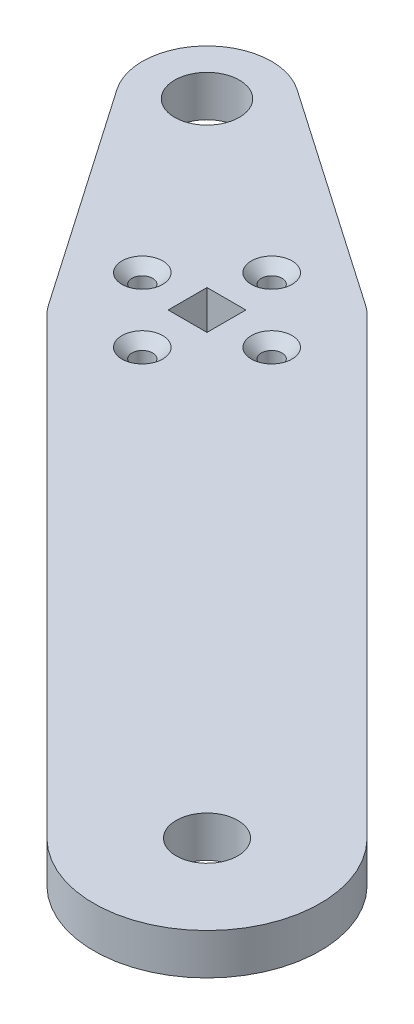
ISO-10303-21;
HEADER;
FILE_DESCRIPTION(('STEP AP214'),'2;1');
FILE_NAME('part.step','',(''),(''),'','','');
FILE_SCHEMA(('AUTOMOTIVE_DESIGN { 1 0 10303 214 1 1 1 1 }'));
ENDSEC;
DATA;
#1=APPLICATION_CONTEXT('core data for automotive mechanical design processes');
#2=APPLICATION_PROTOCOL_DEFINITION('international standard','automotive_design',2000,#1);
#3=PRODUCT_CONTEXT('',#1,'mechanical');
#4=PRODUCT('Part','Part','',(#3));
#5=PRODUCT_RELATED_PRODUCT_CATEGORY('part','',(#4));
#6=PRODUCT_DEFINITION_FORMATION('','',#4);
#7=PRODUCT_DEFINITION_CONTEXT('part definition',#1,'design');
#8=PRODUCT_DEFINITION('design','',#6,#7);
#9=PRODUCT_DEFINITION_SHAPE('','',#8);
#10=(LENGTH_UNIT() NAMED_UNIT(*) SI_UNIT(.MILLI.,.METRE.));
#11=(NAMED_UNIT(*) PLANE_ANGLE_UNIT() SI_UNIT($,.RADIAN.));
#12=(NAMED_UNIT(*) SI_UNIT($,.STERADIAN.) SOLID_ANGLE_UNIT());
#13=UNCERTAINTY_MEASURE_WITH_UNIT(LENGTH_MEASURE(1.E-05),#10,'distance_accuracy_value','');
#14=(GEOMETRIC_REPRESENTATION_CONTEXT(3) GLOBAL_UNCERTAINTY_ASSIGNED_CONTEXT((#13)) GLOBAL_UNIT_ASSIGNED_CONTEXT((#10,
#11,#12)) REPRESENTATION_CONTEXT('',''));
#15=CARTESIAN_POINT('',(0.,0.,0.));
#16=DIRECTION('',(0.,0.,1.));
#17=DIRECTION('',(1.,0.,0.));
#18=AXIS2_PLACEMENT_3D('',#15,#16,#17);
#19=CARTESIAN_POINT('',(70.7106781186546,0.,70.7106781186549));
#20=DIRECTION('',(0.,-1.,0.));
#21=DIRECTION('',(0.,0.,-1.));
#22=AXIS2_PLACEMENT_3D('',#19,#20,#21);
#23=PLANE('',#22);
#24=CARTESIAN_POINT('',(-28.2842712474619,0.,-28.2842712474619));
#25=DIRECTION('',(0.,1.,0.));
#26=DIRECTION('',(0.,0.,1.));
#27=AXIS2_PLACEMENT_3D('',#24,#25,#26);
#28=CIRCLE('',#27,4.99999999999983);
#29=CARTESIAN_POINT('',(-28.2842712474619,0.,-23.2842712474621));
#30=VERTEX_POINT('',#29);
#31=EDGE_CURVE('E311',#30,#30,#28,.T.);
#32=ORIENTED_EDGE('',*,*,#31,.F.);
#33=EDGE_LOOP('',(#32));
#34=FACE_BOUND('',#33,.T.);
#35=CARTESIAN_POINT('',(70.7106781186546,0.,70.7106781186549));
#36=DIRECTION('',(0.,1.,0.));
#37=DIRECTION('',(0.,0.,1.));
#38=AXIS2_PLACEMENT_3D('',#35,#36,#37);
#39=CIRCLE('',#38,4.7625);
#40=CARTESIAN_POINT('',(70.7106781186546,0.,75.4731781186549));
#41=VERTEX_POINT('',#40);
#42=EDGE_CURVE('E152',#41,#41,#39,.T.);
#43=ORIENTED_EDGE('',*,*,#42,.F.);
#44=EDGE_LOOP('',(#43));
#45=FACE_BOUND('',#44,.T.);
#46=DIRECTION('',(1.,0.,0.));
#47=VECTOR('',#46,1.);
#48=CARTESIAN_POINT('',(-3.005,0.,3.005));
#49=LINE('',#48,#47);
#50=CARTESIAN_POINT('',(-3.00499999999999,0.,3.00499999999999));
#51=VERTEX_POINT('',#50);
#52=CARTESIAN_POINT('',(3.005,0.,3.005));
#53=VERTEX_POINT('',#52);
#54=EDGE_CURVE('E158',#51,#53,#49,.T.);
#55=ORIENTED_EDGE('',*,*,#54,.F.);
#56=DIRECTION('',(0.,0.,1.));
#57=VECTOR('',#56,1.);
#58=CARTESIAN_POINT('',(-3.005,0.,-3.005));
#59=LINE('',#58,#57);
#60=CARTESIAN_POINT('',(-3.005,0.,-3.005));
#61=VERTEX_POINT('',#60);
#62=EDGE_CURVE('E129',#61,#51,#59,.T.);
#63=ORIENTED_EDGE('',*,*,#62,.F.);
#64=DIRECTION('',(-1.,0.,0.));
#65=VECTOR('',#64,1.);
#66=CARTESIAN_POINT('',(-3.005,0.,-3.005));
#67=LINE('',#66,#65);
#68=CARTESIAN_POINT('',(3.005,0.,-3.005));
#69=VERTEX_POINT('',#68);
#70=EDGE_CURVE('E146',#69,#61,#67,.T.);
#71=ORIENTED_EDGE('',*,*,#70,.F.);
#72=DIRECTION('',(0.,0.,-1.));
#73=VECTOR('',#72,1.);
#74=CARTESIAN_POINT('',(3.005,0.,-3.005));
#75=LINE('',#74,#73);
#76=EDGE_CURVE('E149',#53,#69,#75,.T.);
#77=ORIENTED_EDGE('',*,*,#76,.F.);
#78=EDGE_LOOP('',(#55,#63,#71,#77));
#79=FACE_BOUND('',#78,.T.);
#80=DIRECTION('',(0.568003807838373,0.,0.823025925643359));
#81=VECTOR('',#80,1.);
#82=CARTESIAN_POINT('',(-36.5145305038955,0.,-22.6042331690782));
#83=LINE('',#82,#81);
#84=CARTESIAN_POINT('',(-36.5145305038955,0.,-22.6042331690782));
#85=VERTEX_POINT('',#84);
#86=CARTESIAN_POINT('',(-12.8907357687995,0.,11.6261632838161));
#87=VERTEX_POINT('',#86);
#88=EDGE_CURVE('E165',#85,#87,#83,.T.);
#89=ORIENTED_EDGE('',*,*,#88,.T.);
#90=CARTESIAN_POINT('',(-4.66047651236588,0.,5.94612520543233));
#91=DIRECTION('',(0.,-1.,0.));
#92=DIRECTION('',(0.,0.,-1.));
#93=AXIS2_PLACEMENT_3D('',#90,#91,#92);
#94=CIRCLE('',#93,10.);
#95=CARTESIAN_POINT('',(-11.7315443242314,0.,13.0171930172978));
#96=VERTEX_POINT('',#95);
#97=EDGE_CURVE('E214',#87,#96,#94,.F.);
#98=ORIENTED_EDGE('',*,*,#97,.T.);
#99=DIRECTION('',(0.707106781186546,0.,0.707106781186549));
#100=VECTOR('',#99,1.);
#101=CARTESIAN_POINT('',(-12.3743686707646,0.,12.3743686707646));
#102=LINE('',#101,#100);
#103=CARTESIAN_POINT('',(58.33630944789,0.,83.0850467894194));
#104=VERTEX_POINT('',#103);
#105=EDGE_CURVE('E188',#96,#104,#102,.T.);
#106=ORIENTED_EDGE('',*,*,#105,.T.);
#107=CARTESIAN_POINT('',(70.7106781186546,0.,70.7106781186549));
#108=DIRECTION('',(0.,1.,0.));
#109=DIRECTION('',(0.,0.,-1.));
#110=AXIS2_PLACEMENT_3D('',#107,#108,#109);
#111=CIRCLE('',#110,17.5);
#112=CARTESIAN_POINT('',(83.0850467894193,0.,58.3363094478903));
#113=VERTEX_POINT('',#112);
#114=EDGE_CURVE('E190',#104,#113,#111,.T.);
#115=ORIENTED_EDGE('',*,*,#114,.T.);
#116=DIRECTION('',(-0.707106781186546,0.,-0.707106781186549));
#117=VECTOR('',#116,1.);
#118=CARTESIAN_POINT('',(12.3743686707646,0.,-12.3743686707646));
#119=LINE('',#118,#117);
#120=CARTESIAN_POINT('',(13.0171930172978,0.,-11.7315443242314));
#121=VERTEX_POINT('',#120);
#122=EDGE_CURVE('E193',#113,#121,#119,.T.);
#123=ORIENTED_EDGE('',*,*,#122,.T.);
#124=CARTESIAN_POINT('',(5.94612520543231,0.,-4.66047651236589));
#125=DIRECTION('',(0.,-1.,0.));
#126=DIRECTION('',(0.,0.,-1.));
#127=AXIS2_PLACEMENT_3D('',#124,#125,#126);
#128=CIRCLE('',#127,10.);
#129=CARTESIAN_POINT('',(11.6261632838161,0.,-12.8907357687995));
#130=VERTEX_POINT('',#129);
#131=EDGE_CURVE('E212',#121,#130,#128,.F.);
#132=ORIENTED_EDGE('',*,*,#131,.T.);
#133=DIRECTION('',(-0.823025925643358,0.,-0.568003807838376));
#134=VECTOR('',#133,1.);
#135=CARTESIAN_POINT('',(-22.6042331690781,0.,-36.5145305038955));
#136=LINE('',#135,#134);
#137=CARTESIAN_POINT('',(-22.6042331690781,0.,-36.5145305038955));
#138=VERTEX_POINT('',#137);
#139=EDGE_CURVE('E196',#130,#138,#136,.T.);
#140=ORIENTED_EDGE('',*,*,#139,.T.);
#141=CARTESIAN_POINT('',(-28.2842712474619,0.,-28.2842712474619));
#142=DIRECTION('',(0.,1.,0.));
#143=DIRECTION('',(0.,0.,1.));
#144=AXIS2_PLACEMENT_3D('',#141,#142,#143);
#145=CIRCLE('',#144,10.);
#146=EDGE_CURVE('E173',#138,#85,#145,.T.);
#147=ORIENTED_EDGE('',*,*,#146,.T.);
#148=EDGE_LOOP('',(#89,#98,#106,#115,#123,#132,#140,#147));
#149=FACE_BOUND('',#148,.T.);
#150=CARTESIAN_POINT('',(0.,0.,10.));
#151=DIRECTION('',(0.,1.,0.));
#152=DIRECTION('',(0.,0.,1.));
#153=AXIS2_PLACEMENT_3D('',#150,#151,#152);
#154=CIRCLE('',#153,3.15);
#155=CARTESIAN_POINT('',(0.,0.,13.15));
#156=VERTEX_POINT('',#155);
#157=EDGE_CURVE('E319',#156,#156,#154,.T.);
#158=ORIENTED_EDGE('',*,*,#157,.F.);
#159=EDGE_LOOP('',(#158));
#160=FACE_BOUND('',#159,.T.);
#161=CARTESIAN_POINT('',(10.,0.,0.));
#162=DIRECTION('',(0.,1.,0.));
#163=DIRECTION('',(0.,0.,1.));
#164=AXIS2_PLACEMENT_3D('',#161,#162,#163);
#165=CIRCLE('',#164,3.15);
#166=CARTESIAN_POINT('',(10.,0.,3.15));
#167=VERTEX_POINT('',#166);
#168=EDGE_CURVE('E326',#167,#167,#165,.T.);
#169=ORIENTED_EDGE('',*,*,#168,.F.);
#170=EDGE_LOOP('',(#169));
#171=FACE_BOUND('',#170,.T.);
#172=CARTESIAN_POINT('',(-10.,0.,0.));
#173=DIRECTION('',(0.,1.,0.));
#174=DIRECTION('',(0.,0.,1.));
#175=AXIS2_PLACEMENT_3D('',#172,#173,#174);
#176=CIRCLE('',#175,3.15);
#177=CARTESIAN_POINT('',(-10.,0.,3.15));
#178=VERTEX_POINT('',#177);
#179=EDGE_CURVE('E333',#178,#178,#176,.T.);
#180=ORIENTED_EDGE('',*,*,#179,.F.);
#181=EDGE_LOOP('',(#180));
#182=FACE_BOUND('',#181,.T.);
#183=CARTESIAN_POINT('',(0.,0.,-10.));
#184=DIRECTION('',(0.,1.,0.));
#185=DIRECTION('',(0.,0.,1.));
#186=AXIS2_PLACEMENT_3D('',#183,#184,#185);
#187=CIRCLE('',#186,3.15);
#188=CARTESIAN_POINT('',(0.,0.,-6.85));
#189=VERTEX_POINT('',#188);
#190=EDGE_CURVE('E340',#189,#189,#187,.T.);
#191=ORIENTED_EDGE('',*,*,#190,.F.);
#192=EDGE_LOOP('',(#191));
#193=FACE_BOUND('',#192,.T.);
#194=ADVANCED_FACE('F33',(#34,#45,#79,#149,#160,#171,#182,#193),#23,.F.);
#195=CARTESIAN_POINT('',(-36.5145305038955,-6.35,-22.6042331690782));
#196=DIRECTION('',(-0.823025925643359,0.,0.568003807838373));
#197=DIRECTION('',(0.568003807838373,0.,0.823025925643359));
#198=AXIS2_PLACEMENT_3D('',#195,#196,#197);
#199=PLANE('',#198);
#200=DIRECTION('',(0.568003807838373,0.,0.823025925643359));
#201=VECTOR('',#200,1.);
#202=CARTESIAN_POINT('',(-36.5145305038955,-6.35,-22.6042331690782));
#203=LINE('',#202,#201);
#204=CARTESIAN_POINT('',(-36.5145305038955,-6.35,-22.6042331690782));
#205=VERTEX_POINT('',#204);
#206=CARTESIAN_POINT('',(-12.8907357687995,-6.35,11.6261632838161));
#207=VERTEX_POINT('',#206);
#208=EDGE_CURVE('E169',#205,#207,#203,.T.);
#209=ORIENTED_EDGE('',*,*,#208,.T.);
#210=DIRECTION('',(0.,1.,0.));
#211=VECTOR('',#210,1.);
#212=CARTESIAN_POINT('',(-12.8907357687995,-6.35,11.6261632838161));
#213=LINE('',#212,#211);
#214=EDGE_CURVE('E202',#207,#87,#213,.T.);
#215=ORIENTED_EDGE('',*,*,#214,.T.);
#216=ORIENTED_EDGE('',*,*,#88,.F.);
#217=DIRECTION('',(0.,1.,0.));
#218=VECTOR('',#217,1.);
#219=CARTESIAN_POINT('',(-36.5145305038955,-6.35,-22.6042331690782));
#220=LINE('',#219,#218);
#221=EDGE_CURVE('E200',#205,#85,#220,.T.);
#222=ORIENTED_EDGE('',*,*,#221,.F.);
#223=EDGE_LOOP('',(#209,#215,#216,#222));
#224=FACE_BOUND('',#223,.T.);
#225=ADVANCED_FACE('F244',(#224),#199,.T.);
#226=CARTESIAN_POINT('',(-28.2842712474619,-6.35,-28.2842712474619));
#227=DIRECTION('',(0.,1.,0.));
#228=DIRECTION('',(0.,0.,1.));
#229=AXIS2_PLACEMENT_3D('',#226,#227,#228);
#230=CYLINDRICAL_SURFACE('',#229,10.);
#231=ORIENTED_EDGE('',*,*,#146,.F.);
#232=DIRECTION('',(0.,1.,0.));
#233=VECTOR('',#232,1.);
#234=CARTESIAN_POINT('',(-22.6042331690781,-6.35,-36.5145305038955));
#235=LINE('',#234,#233);
#236=CARTESIAN_POINT('',(-22.6042331690781,-6.35,-36.5145305038955));
#237=VERTEX_POINT('',#236);
#238=EDGE_CURVE('E203',#237,#138,#235,.T.);
#239=ORIENTED_EDGE('',*,*,#238,.F.);
#240=CARTESIAN_POINT('',(-28.2842712474619,-6.35,-28.2842712474619));
#241=DIRECTION('',(0.,1.,0.));
#242=DIRECTION('',(0.,0.,1.));
#243=AXIS2_PLACEMENT_3D('',#240,#241,#242);
#244=CIRCLE('',#243,10.);
#245=EDGE_CURVE('E182',#237,#205,#244,.T.);
#246=ORIENTED_EDGE('',*,*,#245,.T.);
#247=ORIENTED_EDGE('',*,*,#221,.T.);
#248=EDGE_LOOP('',(#231,#239,#246,#247));
#249=FACE_BOUND('',#248,.T.);
#250=ADVANCED_FACE('F248',(#249),#230,.T.);
#251=CARTESIAN_POINT('',(-22.6042331690781,-6.35,-36.5145305038955));
#252=DIRECTION('',(0.568003807838376,0.,-0.823025925643358));
#253=DIRECTION('',(-0.823025925643358,0.,-0.568003807838376));
#254=AXIS2_PLACEMENT_3D('',#251,#252,#253);
#255=PLANE('',#254);
#256=ORIENTED_EDGE('',*,*,#139,.F.);
#257=DIRECTION('',(0.,1.,0.));
#258=VECTOR('',#257,1.);
#259=CARTESIAN_POINT('',(11.6261632838161,-6.35,-12.8907357687995));
#260=LINE('',#259,#258);
#261=CARTESIAN_POINT('',(11.6261632838161,-6.35,-12.8907357687995));
#262=VERTEX_POINT('',#261);
#263=EDGE_CURVE('E11',#130,#262,#260,.F.);
#264=ORIENTED_EDGE('',*,*,#263,.T.);
#265=DIRECTION('',(-0.823025925643358,0.,-0.568003807838376));
#266=VECTOR('',#265,1.);
#267=CARTESIAN_POINT('',(-22.6042331690781,-6.35,-36.5145305038955));
#268=LINE('',#267,#266);
#269=EDGE_CURVE('E180',#262,#237,#268,.T.);
#270=ORIENTED_EDGE('',*,*,#269,.T.);
#271=ORIENTED_EDGE('',*,*,#238,.T.);
#272=EDGE_LOOP('',(#256,#264,#270,#271));
#273=FACE_BOUND('',#272,.T.);
#274=ADVANCED_FACE('F269',(#273),#255,.T.);
#275=CARTESIAN_POINT('',(12.3743686707646,-6.35,-12.3743686707646));
#276=DIRECTION('',(0.707106781186549,0.,-0.707106781186546));
#277=DIRECTION('',(-0.707106781186546,0.,-0.707106781186549));
#278=AXIS2_PLACEMENT_3D('',#275,#276,#277);
#279=PLANE('',#278);
#280=DIRECTION('',(-0.707106781186546,0.,-0.707106781186549));
#281=VECTOR('',#280,1.);
#282=CARTESIAN_POINT('',(12.3743686707646,-6.35,-12.3743686707646));
#283=LINE('',#282,#281);
#284=CARTESIAN_POINT('',(83.0850467894193,-6.35,58.3363094478903));
#285=VERTEX_POINT('',#284);
#286=CARTESIAN_POINT('',(13.0171930172978,-6.35,-11.7315443242314));
#287=VERTEX_POINT('',#286);
#288=EDGE_CURVE('E178',#285,#287,#283,.T.);
#289=ORIENTED_EDGE('',*,*,#288,.T.);
#290=DIRECTION('',(0.,1.,0.));
#291=VECTOR('',#290,1.);
#292=CARTESIAN_POINT('',(13.0171930172978,-6.35,-11.7315443242314));
#293=LINE('',#292,#291);
#294=EDGE_CURVE('E41',#287,#121,#293,.T.);
#295=ORIENTED_EDGE('',*,*,#294,.T.);
#296=ORIENTED_EDGE('',*,*,#122,.F.);
#297=DIRECTION('',(0.,1.,0.));
#298=VECTOR('',#297,1.);
#299=CARTESIAN_POINT('',(83.0850467894193,-6.35,58.3363094478903));
#300=LINE('',#299,#298);
#301=EDGE_CURVE('E206',#285,#113,#300,.T.);
#302=ORIENTED_EDGE('',*,*,#301,.F.);
#303=EDGE_LOOP('',(#289,#295,#296,#302));
#304=FACE_BOUND('',#303,.T.);
#305=ADVANCED_FACE('F224',(#304),#279,.T.);
#306=CARTESIAN_POINT('',(70.7106781186546,-6.35,70.7106781186549));
#307=DIRECTION('',(0.,1.,0.));
#308=DIRECTION('',(0.,0.,1.));
#309=AXIS2_PLACEMENT_3D('',#306,#307,#308);
#310=CYLINDRICAL_SURFACE('',#309,17.5);
#311=ORIENTED_EDGE('',*,*,#114,.F.);
#312=DIRECTION('',(0.,1.,0.));
#313=VECTOR('',#312,1.);
#314=CARTESIAN_POINT('',(58.33630944789,-6.35,83.0850467894194));
#315=LINE('',#314,#313);
#316=CARTESIAN_POINT('',(58.33630944789,-6.35,83.0850467894194));
#317=VERTEX_POINT('',#316);
#318=EDGE_CURVE('E185',#317,#104,#315,.T.);
#319=ORIENTED_EDGE('',*,*,#318,.F.);
#320=CARTESIAN_POINT('',(70.7106781186546,-6.35,70.7106781186549));
#321=DIRECTION('',(0.,1.,0.));
#322=DIRECTION('',(0.,0.,-1.));
#323=AXIS2_PLACEMENT_3D('',#320,#321,#322);
#324=CIRCLE('',#323,17.5);
#325=EDGE_CURVE('E175',#317,#285,#324,.T.);
#326=ORIENTED_EDGE('',*,*,#325,.T.);
#327=ORIENTED_EDGE('',*,*,#301,.T.);
#328=EDGE_LOOP('',(#311,#319,#326,#327));
#329=FACE_BOUND('',#328,.T.);
#330=ADVANCED_FACE('F232',(#329),#310,.T.);
#331=CARTESIAN_POINT('',(-12.3743686707646,-6.35,12.3743686707646));
#332=DIRECTION('',(-0.707106781186549,0.,0.707106781186546));
#333=DIRECTION('',(0.707106781186546,0.,0.707106781186549));
#334=AXIS2_PLACEMENT_3D('',#331,#332,#333);
#335=PLANE('',#334);
#336=ORIENTED_EDGE('',*,*,#105,.F.);
#337=DIRECTION('',(0.,1.,0.));
#338=VECTOR('',#337,1.);
#339=CARTESIAN_POINT('',(-11.7315443242314,-6.35,13.0171930172978));
#340=LINE('',#339,#338);
#341=CARTESIAN_POINT('',(-11.7315443242314,-6.35,13.0171930172978));
#342=VERTEX_POINT('',#341);
#343=EDGE_CURVE('E216',#96,#342,#340,.F.);
#344=ORIENTED_EDGE('',*,*,#343,.T.);
#345=DIRECTION('',(0.707106781186546,0.,0.707106781186549));
#346=VECTOR('',#345,1.);
#347=CARTESIAN_POINT('',(-12.3743686707646,-6.35,12.3743686707646));
#348=LINE('',#347,#346);
#349=EDGE_CURVE('E172',#342,#317,#348,.T.);
#350=ORIENTED_EDGE('',*,*,#349,.T.);
#351=ORIENTED_EDGE('',*,*,#318,.T.);
#352=EDGE_LOOP('',(#336,#344,#350,#351));
#353=FACE_BOUND('',#352,.T.);
#354=ADVANCED_FACE('F276',(#353),#335,.T.);
#355=CARTESIAN_POINT('',(70.7106781186546,-6.35,70.7106781186549));
#356=DIRECTION('',(0.,-1.,0.));
#357=DIRECTION('',(0.,0.,-1.));
#358=AXIS2_PLACEMENT_3D('',#355,#356,#357);
#359=PLANE('',#358);
#360=CARTESIAN_POINT('',(0.,-6.35,-10.));
#361=DIRECTION('',(0.,-1.,0.));
#362=DIRECTION('',(0.,0.,-1.));
#363=AXIS2_PLACEMENT_3D('',#360,#361,#362);
#364=CIRCLE('',#363,1.6);
#365=CARTESIAN_POINT('',(0.,-6.35,-11.6));
#366=VERTEX_POINT('',#365);
#367=EDGE_CURVE('E289',#366,#366,#364,.T.);
#368=ORIENTED_EDGE('',*,*,#367,.F.);
#369=EDGE_LOOP('',(#368));
#370=FACE_BOUND('',#369,.T.);
#371=CARTESIAN_POINT('',(-10.,-6.35,0.));
#372=DIRECTION('',(0.,-1.,0.));
#373=DIRECTION('',(0.,0.,-1.));
#374=AXIS2_PLACEMENT_3D('',#371,#372,#373);
#375=CIRCLE('',#374,1.6);
#376=CARTESIAN_POINT('',(-10.,-6.35,-1.6));
#377=VERTEX_POINT('',#376);
#378=EDGE_CURVE('E293',#377,#377,#375,.T.);
#379=ORIENTED_EDGE('',*,*,#378,.F.);
#380=EDGE_LOOP('',(#379));
#381=FACE_BOUND('',#380,.T.);
#382=CARTESIAN_POINT('',(10.,-6.35,0.));
#383=DIRECTION('',(0.,-1.,0.));
#384=DIRECTION('',(0.,0.,-1.));
#385=AXIS2_PLACEMENT_3D('',#382,#383,#384);
#386=CIRCLE('',#385,1.6);
#387=CARTESIAN_POINT('',(10.,-6.35,-1.6));
#388=VERTEX_POINT('',#387);
#389=EDGE_CURVE('E297',#388,#388,#386,.T.);
#390=ORIENTED_EDGE('',*,*,#389,.F.);
#391=EDGE_LOOP('',(#390));
#392=FACE_BOUND('',#391,.T.);
#393=CARTESIAN_POINT('',(0.,-6.35,10.));
#394=DIRECTION('',(0.,-1.,0.));
#395=DIRECTION('',(0.,0.,-1.));
#396=AXIS2_PLACEMENT_3D('',#393,#394,#395);
#397=CIRCLE('',#396,1.6);
#398=CARTESIAN_POINT('',(0.,-6.35,8.4));
#399=VERTEX_POINT('',#398);
#400=EDGE_CURVE('E301',#399,#399,#397,.T.);
#401=ORIENTED_EDGE('',*,*,#400,.F.);
#402=EDGE_LOOP('',(#401));
#403=FACE_BOUND('',#402,.T.);
#404=CARTESIAN_POINT('',(-28.2842712474619,-6.35,-28.2842712474619));
#405=DIRECTION('',(0.,1.,0.));
#406=DIRECTION('',(0.,0.,1.));
#407=AXIS2_PLACEMENT_3D('',#404,#405,#406);
#408=CIRCLE('',#407,4.99999999999983);
#409=CARTESIAN_POINT('',(-28.2842712474619,-6.35,-23.2842712474621));
#410=VERTEX_POINT('',#409);
#411=EDGE_CURVE('E305',#410,#410,#408,.T.);
#412=ORIENTED_EDGE('',*,*,#411,.T.);
#413=EDGE_LOOP('',(#412));
#414=FACE_BOUND('',#413,.T.);
#415=CARTESIAN_POINT('',(70.7106781186546,-6.35,70.7106781186549));
#416=DIRECTION('',(0.,1.,0.));
#417=DIRECTION('',(0.,0.,1.));
#418=AXIS2_PLACEMENT_3D('',#415,#416,#417);
#419=CIRCLE('',#418,4.7625);
#420=CARTESIAN_POINT('',(70.7106781186546,-6.35,75.4731781186549));
#421=VERTEX_POINT('',#420);
#422=EDGE_CURVE('E159',#421,#421,#419,.T.);
#423=ORIENTED_EDGE('',*,*,#422,.T.);
#424=EDGE_LOOP('',(#423));
#425=FACE_BOUND('',#424,.T.);
#426=DIRECTION('',(0.,0.,1.));
#427=VECTOR('',#426,1.);
#428=CARTESIAN_POINT('',(-3.005,-6.35,-3.005));
#429=LINE('',#428,#427);
#430=CARTESIAN_POINT('',(-3.005,-6.35,-3.005));
#431=VERTEX_POINT('',#430);
#432=CARTESIAN_POINT('',(-3.005,-6.35,3.005));
#433=VERTEX_POINT('',#432);
#434=EDGE_CURVE('E126',#431,#433,#429,.T.);
#435=ORIENTED_EDGE('',*,*,#434,.T.);
#436=DIRECTION('',(1.,0.,0.));
#437=VECTOR('',#436,1.);
#438=CARTESIAN_POINT('',(-3.005,-6.35,3.005));
#439=LINE('',#438,#437);
#440=CARTESIAN_POINT('',(3.00499999999999,-6.35,3.00499999999999));
#441=VERTEX_POINT('',#440);
#442=EDGE_CURVE('E138',#433,#441,#439,.T.);
#443=ORIENTED_EDGE('',*,*,#442,.T.);
#444=DIRECTION('',(0.,0.,-1.));
#445=VECTOR('',#444,1.);
#446=CARTESIAN_POINT('',(3.005,-6.35,-3.005));
#447=LINE('',#446,#445);
#448=CARTESIAN_POINT('',(3.005,-6.35,-3.005));
#449=VERTEX_POINT('',#448);
#450=EDGE_CURVE('E142',#441,#449,#447,.T.);
#451=ORIENTED_EDGE('',*,*,#450,.T.);
#452=DIRECTION('',(-1.,0.,0.));
#453=VECTOR('',#452,1.);
#454=CARTESIAN_POINT('',(-3.005,-6.35,-3.005));
#455=LINE('',#454,#453);
#456=EDGE_CURVE('E134',#449,#431,#455,.T.);
#457=ORIENTED_EDGE('',*,*,#456,.T.);
#458=EDGE_LOOP('',(#435,#443,#451,#457));
#459=FACE_BOUND('',#458,.T.);
#460=ORIENTED_EDGE('',*,*,#349,.F.);
#461=CARTESIAN_POINT('',(-4.66047651236588,-6.35,5.94612520543233));
#462=DIRECTION('',(0.,-1.,0.));
#463=DIRECTION('',(0.,0.,-1.));
#464=AXIS2_PLACEMENT_3D('',#461,#462,#463);
#465=CIRCLE('',#464,10.);
#466=EDGE_CURVE('E219',#342,#207,#465,.T.);
#467=ORIENTED_EDGE('',*,*,#466,.T.);
#468=ORIENTED_EDGE('',*,*,#208,.F.);
#469=ORIENTED_EDGE('',*,*,#245,.F.);
#470=ORIENTED_EDGE('',*,*,#269,.F.);
#471=CARTESIAN_POINT('',(5.94612520543231,-6.35,-4.66047651236589));
#472=DIRECTION('',(0.,-1.,0.));
#473=DIRECTION('',(0.,0.,-1.));
#474=AXIS2_PLACEMENT_3D('',#471,#472,#473);
#475=CIRCLE('',#474,10.);
#476=EDGE_CURVE('E48',#262,#287,#475,.T.);
#477=ORIENTED_EDGE('',*,*,#476,.T.);
#478=ORIENTED_EDGE('',*,*,#288,.F.);
#479=ORIENTED_EDGE('',*,*,#325,.F.);
#480=EDGE_LOOP('',(#460,#467,#468,#469,#470,#477,#478,#479));
#481=FACE_BOUND('',#480,.T.);
#482=ADVANCED_FACE('F144',(#370,#381,#392,#403,#414,#425,#459,#481),#359,.T.);
#483=CARTESIAN_POINT('',(-3.005,-6.35,-3.005));
#484=DIRECTION('',(-1.,0.,0.));
#485=DIRECTION('',(0.,0.,1.));
#486=AXIS2_PLACEMENT_3D('',#483,#484,#485);
#487=PLANE('',#486);
#488=ORIENTED_EDGE('',*,*,#62,.T.);
#489=DIRECTION('',(0.,1.,0.));
#490=VECTOR('',#489,1.);
#491=CARTESIAN_POINT('',(-3.005,-6.35,3.005));
#492=LINE('',#491,#490);
#493=EDGE_CURVE('E122',#433,#51,#492,.T.);
#494=ORIENTED_EDGE('',*,*,#493,.F.);
#495=ORIENTED_EDGE('',*,*,#434,.F.);
#496=DIRECTION('',(0.,1.,0.));
#497=VECTOR('',#496,1.);
#498=CARTESIAN_POINT('',(-3.005,-6.35,-3.005));
#499=LINE('',#498,#497);
#500=EDGE_CURVE('E163',#431,#61,#499,.T.);
#501=ORIENTED_EDGE('',*,*,#500,.T.);
#502=EDGE_LOOP('',(#488,#494,#495,#501));
#503=FACE_BOUND('',#502,.T.);
#504=ADVANCED_FACE('F124',(#503),#487,.F.);
#505=CARTESIAN_POINT('',(-3.005,-6.35,-3.005));
#506=DIRECTION('',(0.,0.,-1.));
#507=DIRECTION('',(-1.,0.,0.));
#508=AXIS2_PLACEMENT_3D('',#505,#506,#507);
#509=PLANE('',#508);
#510=ORIENTED_EDGE('',*,*,#70,.T.);
#511=ORIENTED_EDGE('',*,*,#500,.F.);
#512=ORIENTED_EDGE('',*,*,#456,.F.);
#513=DIRECTION('',(0.,1.,0.));
#514=VECTOR('',#513,1.);
#515=CARTESIAN_POINT('',(3.005,-6.35,-3.005));
#516=LINE('',#515,#514);
#517=EDGE_CURVE('E166',#449,#69,#516,.T.);
#518=ORIENTED_EDGE('',*,*,#517,.T.);
#519=EDGE_LOOP('',(#510,#511,#512,#518));
#520=FACE_BOUND('',#519,.T.);
#521=ADVANCED_FACE('F285',(#520),#509,.F.);
#522=CARTESIAN_POINT('',(3.005,-6.35,-3.005));
#523=DIRECTION('',(1.,0.,0.));
#524=DIRECTION('',(0.,0.,-1.));
#525=AXIS2_PLACEMENT_3D('',#522,#523,#524);
#526=PLANE('',#525);
#527=ORIENTED_EDGE('',*,*,#76,.T.);
#528=ORIENTED_EDGE('',*,*,#517,.F.);
#529=ORIENTED_EDGE('',*,*,#450,.F.);
#530=DIRECTION('',(0.,1.,0.));
#531=VECTOR('',#530,1.);
#532=CARTESIAN_POINT('',(3.005,-6.35,3.005));
#533=LINE('',#532,#531);
#534=EDGE_CURVE('E133',#441,#53,#533,.T.);
#535=ORIENTED_EDGE('',*,*,#534,.T.);
#536=EDGE_LOOP('',(#527,#528,#529,#535));
#537=FACE_BOUND('',#536,.T.);
#538=ADVANCED_FACE('F389',(#537),#526,.F.);
#539=CARTESIAN_POINT('',(-3.005,-6.35,3.005));
#540=DIRECTION('',(0.,0.,1.));
#541=DIRECTION('',(1.,0.,0.));
#542=AXIS2_PLACEMENT_3D('',#539,#540,#541);
#543=PLANE('',#542);
#544=ORIENTED_EDGE('',*,*,#54,.T.);
#545=ORIENTED_EDGE('',*,*,#534,.F.);
#546=ORIENTED_EDGE('',*,*,#442,.F.);
#547=ORIENTED_EDGE('',*,*,#493,.T.);
#548=EDGE_LOOP('',(#544,#545,#546,#547));
#549=FACE_BOUND('',#548,.T.);
#550=ADVANCED_FACE('F139',(#549),#543,.F.);
#551=CARTESIAN_POINT('',(70.7106781186546,-6.35,70.7106781186549));
#552=DIRECTION('',(0.,1.,0.));
#553=DIRECTION('',(0.,0.,1.));
#554=AXIS2_PLACEMENT_3D('',#551,#552,#553);
#555=CYLINDRICAL_SURFACE('',#554,4.7625);
#556=ORIENTED_EDGE('',*,*,#422,.F.);
#557=EDGE_LOOP('',(#556));
#558=FACE_BOUND('',#557,.T.);
#559=ORIENTED_EDGE('',*,*,#42,.T.);
#560=EDGE_LOOP('',(#559));
#561=FACE_BOUND('',#560,.T.);
#562=ADVANCED_FACE('F383',(#558,#561),#555,.F.);
#563=CARTESIAN_POINT('',(-28.2842712474619,-6.35,-28.2842712474619));
#564=DIRECTION('',(0.,1.,0.));
#565=DIRECTION('',(0.,0.,1.));
#566=AXIS2_PLACEMENT_3D('',#563,#564,#565);
#567=CYLINDRICAL_SURFACE('',#566,4.99999999999983);
#568=ORIENTED_EDGE('',*,*,#411,.F.);
#569=EDGE_LOOP('',(#568));
#570=FACE_BOUND('',#569,.T.);
#571=ORIENTED_EDGE('',*,*,#31,.T.);
#572=EDGE_LOOP('',(#571));
#573=FACE_BOUND('',#572,.T.);
#574=ADVANCED_FACE('F379',(#570,#573),#567,.F.);
#575=CARTESIAN_POINT('',(0.,0.,10.));
#576=DIRECTION('',(0.,1.,0.));
#577=DIRECTION('',(0.,0.,1.));
#578=AXIS2_PLACEMENT_3D('',#575,#576,#577);
#579=CYLINDRICAL_SURFACE('',#578,1.6);
#580=CARTESIAN_POINT('',(0.,-1.55,10.));
#581=DIRECTION('',(0.,1.,0.));
#582=DIRECTION('',(0.,0.,1.));
#583=AXIS2_PLACEMENT_3D('',#580,#581,#582);
#584=CIRCLE('',#583,1.6);
#585=CARTESIAN_POINT('',(0.,-1.55,11.6));
#586=VERTEX_POINT('',#585);
#587=EDGE_CURVE('E316',#586,#586,#584,.T.);
#588=ORIENTED_EDGE('',*,*,#587,.T.);
#589=EDGE_LOOP('',(#588));
#590=FACE_BOUND('',#589,.T.);
#591=ORIENTED_EDGE('',*,*,#400,.T.);
#592=EDGE_LOOP('',(#591));
#593=FACE_BOUND('',#592,.T.);
#594=ADVANCED_FACE('F375',(#590,#593),#579,.F.);
#595=CARTESIAN_POINT('',(0.,0.,10.));
#596=DIRECTION('',(0.,1.,0.));
#597=DIRECTION('',(0.,0.,1.));
#598=AXIS2_PLACEMENT_3D('',#595,#596,#597);
#599=CONICAL_SURFACE('',#598,3.15,0.785398163397448);
#600=ORIENTED_EDGE('',*,*,#587,.F.);
#601=EDGE_LOOP('',(#600));
#602=FACE_BOUND('',#601,.T.);
#603=ORIENTED_EDGE('',*,*,#157,.T.);
#604=EDGE_LOOP('',(#603));
#605=FACE_BOUND('',#604,.T.);
#606=ADVANCED_FACE('F371',(#602,#605),#599,.F.);
#607=CARTESIAN_POINT('',(10.,0.,0.));
#608=DIRECTION('',(0.,1.,0.));
#609=DIRECTION('',(0.,0.,1.));
#610=AXIS2_PLACEMENT_3D('',#607,#608,#609);
#611=CYLINDRICAL_SURFACE('',#610,1.6);
#612=CARTESIAN_POINT('',(10.,-1.55,0.));
#613=DIRECTION('',(0.,1.,0.));
#614=DIRECTION('',(0.,0.,1.));
#615=AXIS2_PLACEMENT_3D('',#612,#613,#614);
#616=CIRCLE('',#615,1.6);
#617=CARTESIAN_POINT('',(10.,-1.55,1.6));
#618=VERTEX_POINT('',#617);
#619=EDGE_CURVE('E323',#618,#618,#616,.T.);
#620=ORIENTED_EDGE('',*,*,#619,.T.);
#621=EDGE_LOOP('',(#620));
#622=FACE_BOUND('',#621,.T.);
#623=ORIENTED_EDGE('',*,*,#389,.T.);
#624=EDGE_LOOP('',(#623));
#625=FACE_BOUND('',#624,.T.);
#626=ADVANCED_FACE('F367',(#622,#625),#611,.F.);
#627=CARTESIAN_POINT('',(10.,0.,0.));
#628=DIRECTION('',(0.,1.,0.));
#629=DIRECTION('',(0.,0.,1.));
#630=AXIS2_PLACEMENT_3D('',#627,#628,#629);
#631=CONICAL_SURFACE('',#630,3.15,0.785398163397448);
#632=ORIENTED_EDGE('',*,*,#619,.F.);
#633=EDGE_LOOP('',(#632));
#634=FACE_BOUND('',#633,.T.);
#635=ORIENTED_EDGE('',*,*,#168,.T.);
#636=EDGE_LOOP('',(#635));
#637=FACE_BOUND('',#636,.T.);
#638=ADVANCED_FACE('F363',(#634,#637),#631,.F.);
#639=CARTESIAN_POINT('',(-10.,0.,0.));
#640=DIRECTION('',(0.,1.,0.));
#641=DIRECTION('',(0.,0.,1.));
#642=AXIS2_PLACEMENT_3D('',#639,#640,#641);
#643=CYLINDRICAL_SURFACE('',#642,1.6);
#644=CARTESIAN_POINT('',(-10.,-1.55,0.));
#645=DIRECTION('',(0.,1.,0.));
#646=DIRECTION('',(0.,0.,1.));
#647=AXIS2_PLACEMENT_3D('',#644,#645,#646);
#648=CIRCLE('',#647,1.6);
#649=CARTESIAN_POINT('',(-10.,-1.55,1.6));
#650=VERTEX_POINT('',#649);
#651=EDGE_CURVE('E330',#650,#650,#648,.T.);
#652=ORIENTED_EDGE('',*,*,#651,.T.);
#653=EDGE_LOOP('',(#652));
#654=FACE_BOUND('',#653,.T.);
#655=ORIENTED_EDGE('',*,*,#378,.T.);
#656=EDGE_LOOP('',(#655));
#657=FACE_BOUND('',#656,.T.);
#658=ADVANCED_FACE('F359',(#654,#657),#643,.F.);
#659=CARTESIAN_POINT('',(-10.,0.,0.));
#660=DIRECTION('',(0.,1.,0.));
#661=DIRECTION('',(0.,0.,1.));
#662=AXIS2_PLACEMENT_3D('',#659,#660,#661);
#663=CONICAL_SURFACE('',#662,3.15,0.785398163397448);
#664=ORIENTED_EDGE('',*,*,#651,.F.);
#665=EDGE_LOOP('',(#664));
#666=FACE_BOUND('',#665,.T.);
#667=ORIENTED_EDGE('',*,*,#179,.T.);
#668=EDGE_LOOP('',(#667));
#669=FACE_BOUND('',#668,.T.);
#670=ADVANCED_FACE('F352',(#666,#669),#663,.F.);
#671=CARTESIAN_POINT('',(0.,0.,-10.));
#672=DIRECTION('',(0.,1.,0.));
#673=DIRECTION('',(0.,0.,1.));
#674=AXIS2_PLACEMENT_3D('',#671,#672,#673);
#675=CYLINDRICAL_SURFACE('',#674,1.6);
#676=CARTESIAN_POINT('',(0.,-1.55,-10.));
#677=DIRECTION('',(0.,1.,0.));
#678=DIRECTION('',(0.,0.,1.));
#679=AXIS2_PLACEMENT_3D('',#676,#677,#678);
#680=CIRCLE('',#679,1.6);
#681=CARTESIAN_POINT('',(0.,-1.55,-8.4));
#682=VERTEX_POINT('',#681);
#683=EDGE_CURVE('E337',#682,#682,#680,.T.);
#684=ORIENTED_EDGE('',*,*,#683,.T.);
#685=EDGE_LOOP('',(#684));
#686=FACE_BOUND('',#685,.T.);
#687=ORIENTED_EDGE('',*,*,#367,.T.);
#688=EDGE_LOOP('',(#687));
#689=FACE_BOUND('',#688,.T.);
#690=ADVANCED_FACE('F346',(#686,#689),#675,.F.);
#691=CARTESIAN_POINT('',(0.,0.,-10.));
#692=DIRECTION('',(0.,1.,0.));
#693=DIRECTION('',(0.,0.,1.));
#694=AXIS2_PLACEMENT_3D('',#691,#692,#693);
#695=CONICAL_SURFACE('',#694,3.15,0.785398163397448);
#696=ORIENTED_EDGE('',*,*,#683,.F.);
#697=EDGE_LOOP('',(#696));
#698=FACE_BOUND('',#697,.T.);
#699=ORIENTED_EDGE('',*,*,#190,.T.);
#700=EDGE_LOOP('',(#699));
#701=FACE_BOUND('',#700,.T.);
#702=ADVANCED_FACE('F254',(#698,#701),#695,.F.);
#703=CARTESIAN_POINT('',(-4.66047651236588,-6.35,5.94612520543233));
#704=DIRECTION('',(0.,1.,0.));
#705=DIRECTION('',(0.,0.,1.));
#706=AXIS2_PLACEMENT_3D('',#703,#704,#705);
#707=CYLINDRICAL_SURFACE('',#706,10.);
#708=ORIENTED_EDGE('',*,*,#466,.F.);
#709=ORIENTED_EDGE('',*,*,#343,.F.);
#710=ORIENTED_EDGE('',*,*,#97,.F.);
#711=ORIENTED_EDGE('',*,*,#214,.F.);
#712=EDGE_LOOP('',(#708,#709,#710,#711));
#713=FACE_BOUND('',#712,.T.);
#714=ADVANCED_FACE('F241',(#713),#707,.T.);
#715=CARTESIAN_POINT('',(5.94612520543231,-6.35,-4.66047651236589));
#716=DIRECTION('',(0.,1.,0.));
#717=DIRECTION('',(0.,0.,1.));
#718=AXIS2_PLACEMENT_3D('',#715,#716,#717);
#719=CYLINDRICAL_SURFACE('',#718,10.);
#720=ORIENTED_EDGE('',*,*,#476,.F.);
#721=ORIENTED_EDGE('',*,*,#263,.F.);
#722=ORIENTED_EDGE('',*,*,#131,.F.);
#723=ORIENTED_EDGE('',*,*,#294,.F.);
#724=EDGE_LOOP('',(#720,#721,#722,#723));
#725=FACE_BOUND('',#724,.T.);
#726=ADVANCED_FACE('F35',(#725),#719,.T.);
#727=CLOSED_SHELL('',(#194,#225,#250,#274,#305,#330,#354,#482,#504,#521,#538,#550,#562,#574,
#594,#606,#626,#638,#658,#670,#690,#702,#714,#726));
#728=MANIFOLD_SOLID_BREP('B2',#727);
#729=ADVANCED_BREP_SHAPE_REPRESENTATION('',(#18,#728),#14);
#730=SHAPE_DEFINITION_REPRESENTATION(#9,#729);
ENDSEC;
END-ISO-10303-21;
